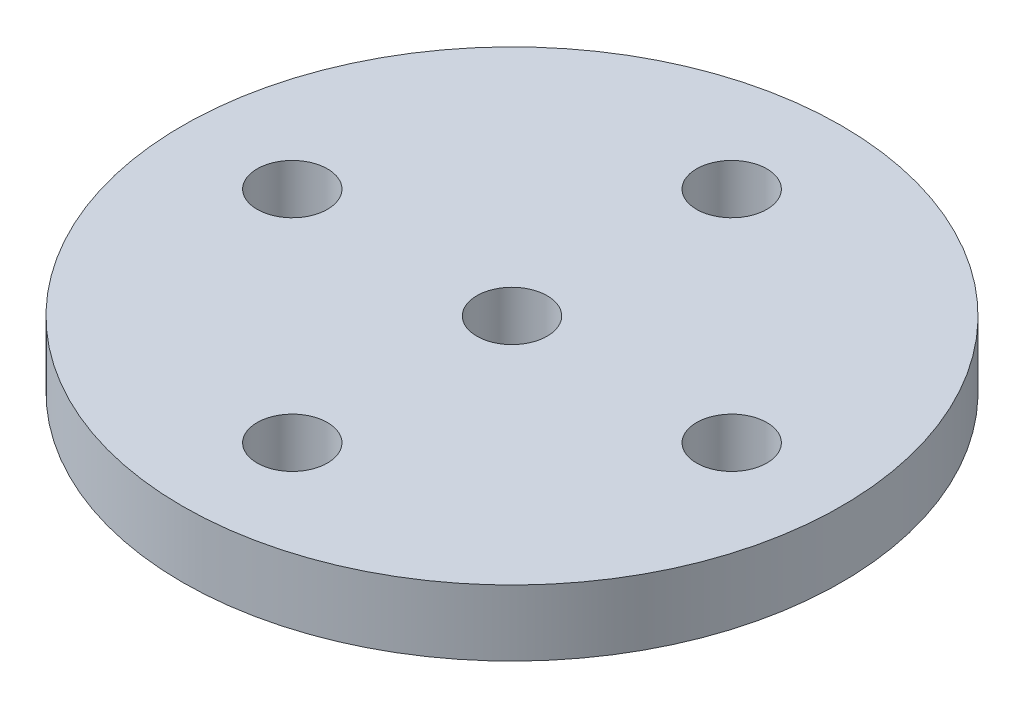
ISO-10303-21;
HEADER;
FILE_DESCRIPTION(('STEP AP214'),'2;1');
FILE_NAME('part.step','',(''),(''),'','','');
FILE_SCHEMA(('AUTOMOTIVE_DESIGN { 1 0 10303 214 1 1 1 1 }'));
ENDSEC;
DATA;
#1=APPLICATION_CONTEXT('core data for automotive mechanical design processes');
#2=APPLICATION_PROTOCOL_DEFINITION('international standard','automotive_design',2000,#1);
#3=PRODUCT_CONTEXT('',#1,'mechanical');
#4=PRODUCT('Part','Part','',(#3));
#5=PRODUCT_RELATED_PRODUCT_CATEGORY('part','',(#4));
#6=PRODUCT_DEFINITION_FORMATION('','',#4);
#7=PRODUCT_DEFINITION_CONTEXT('part definition',#1,'design');
#8=PRODUCT_DEFINITION('design','',#6,#7);
#9=PRODUCT_DEFINITION_SHAPE('','',#8);
#10=(LENGTH_UNIT() NAMED_UNIT(*) SI_UNIT(.MILLI.,.METRE.));
#11=(NAMED_UNIT(*) PLANE_ANGLE_UNIT() SI_UNIT($,.RADIAN.));
#12=(NAMED_UNIT(*) SI_UNIT($,.STERADIAN.) SOLID_ANGLE_UNIT());
#13=UNCERTAINTY_MEASURE_WITH_UNIT(LENGTH_MEASURE(1.E-05),#10,'distance_accuracy_value','');
#14=(GEOMETRIC_REPRESENTATION_CONTEXT(3) GLOBAL_UNCERTAINTY_ASSIGNED_CONTEXT((#13)) GLOBAL_UNIT_ASSIGNED_CONTEXT((#10,
#11,#12)) REPRESENTATION_CONTEXT('',''));
#15=CARTESIAN_POINT('',(0.,0.,0.));
#16=DIRECTION('',(0.,0.,1.));
#17=DIRECTION('',(1.,0.,0.));
#18=AXIS2_PLACEMENT_3D('',#15,#16,#17);
#19=CARTESIAN_POINT('',(0.,3.,0.));
#20=DIRECTION('',(0.,1.,0.));
#21=DIRECTION('',(0.,0.,1.));
#22=AXIS2_PLACEMENT_3D('',#19,#20,#21);
#23=PLANE('',#22);
#24=CARTESIAN_POINT('',(5.6598501634576E-13,3.,10.));
#25=DIRECTION('',(0.,1.,0.));
#26=DIRECTION('',(0.,0.,1.));
#27=AXIS2_PLACEMENT_3D('',#24,#25,#26);
#28=CIRCLE('',#27,1.60000000000061);
#29=CARTESIAN_POINT('',(5.6598501634576E-13,3.,11.6000000000006));
#30=VERTEX_POINT('',#29);
#31=EDGE_CURVE('E61',#30,#30,#28,.T.);
#32=ORIENTED_EDGE('',*,*,#31,.F.);
#33=EDGE_LOOP('',(#32));
#34=FACE_BOUND('',#33,.T.);
#35=CARTESIAN_POINT('',(0.,3.,-10.));
#36=DIRECTION('',(0.,1.,0.));
#37=DIRECTION('',(0.,0.,1.));
#38=AXIS2_PLACEMENT_3D('',#35,#36,#37);
#39=CIRCLE('',#38,1.6);
#40=CARTESIAN_POINT('',(0.,3.,-8.4));
#41=VERTEX_POINT('',#40);
#42=EDGE_CURVE('E49',#41,#41,#39,.T.);
#43=ORIENTED_EDGE('',*,*,#42,.F.);
#44=EDGE_LOOP('',(#43));
#45=FACE_BOUND('',#44,.T.);
#46=CARTESIAN_POINT('',(0.,3.,0.));
#47=DIRECTION('',(0.,1.,0.));
#48=DIRECTION('',(0.,0.,1.));
#49=AXIS2_PLACEMENT_3D('',#46,#47,#48);
#50=CIRCLE('',#49,15.);
#51=CARTESIAN_POINT('',(0.,3.,15.));
#52=VERTEX_POINT('',#51);
#53=EDGE_CURVE('E10',#52,#52,#50,.T.);
#54=ORIENTED_EDGE('',*,*,#53,.T.);
#55=EDGE_LOOP('',(#54));
#56=FACE_BOUND('',#55,.T.);
#57=CARTESIAN_POINT('',(0.,3.,0.));
#58=DIRECTION('',(0.,1.,0.));
#59=DIRECTION('',(0.,0.,1.));
#60=AXIS2_PLACEMENT_3D('',#57,#58,#59);
#61=CIRCLE('',#60,1.6);
#62=CARTESIAN_POINT('',(0.,3.,1.6));
#63=VERTEX_POINT('',#62);
#64=EDGE_CURVE('E44',#63,#63,#61,.T.);
#65=ORIENTED_EDGE('',*,*,#64,.F.);
#66=EDGE_LOOP('',(#65));
#67=FACE_BOUND('',#66,.T.);
#68=CARTESIAN_POINT('',(10.0000000000003,3.,-2.8299250817288E-13));
#69=DIRECTION('',(0.,1.,0.));
#70=DIRECTION('',(0.,0.,1.));
#71=AXIS2_PLACEMENT_3D('',#68,#69,#70);
#72=CIRCLE('',#71,1.60000000000022);
#73=CARTESIAN_POINT('',(10.0000000000003,3.,1.59999999999994));
#74=VERTEX_POINT('',#73);
#75=EDGE_CURVE('E55',#74,#74,#72,.T.);
#76=ORIENTED_EDGE('',*,*,#75,.F.);
#77=EDGE_LOOP('',(#76));
#78=FACE_BOUND('',#77,.T.);
#79=CARTESIAN_POINT('',(-9.99999999999972,3.,2.84217154972027E-13));
#80=DIRECTION('',(0.,1.,0.));
#81=DIRECTION('',(0.,0.,1.));
#82=AXIS2_PLACEMENT_3D('',#79,#80,#81);
#83=CIRCLE('',#82,1.60000000000046);
#84=CARTESIAN_POINT('',(-9.99999999999972,3.,1.60000000000074));
#85=VERTEX_POINT('',#84);
#86=EDGE_CURVE('E67',#85,#85,#83,.T.);
#87=ORIENTED_EDGE('',*,*,#86,.F.);
#88=EDGE_LOOP('',(#87));
#89=FACE_BOUND('',#88,.T.);
#90=ADVANCED_FACE('F33',(#34,#45,#56,#67,#78,#89),#23,.T.);
#91=CARTESIAN_POINT('',(0.,0.,0.));
#92=DIRECTION('',(0.,1.,0.));
#93=DIRECTION('',(0.,0.,1.));
#94=AXIS2_PLACEMENT_3D('',#91,#92,#93);
#95=PLANE('',#94);
#96=CARTESIAN_POINT('',(5.6598501634576E-13,0.,10.));
#97=DIRECTION('',(0.,1.,0.));
#98=DIRECTION('',(0.,0.,1.));
#99=AXIS2_PLACEMENT_3D('',#96,#97,#98);
#100=CIRCLE('',#99,1.60000000000061);
#101=CARTESIAN_POINT('',(5.6598501634576E-13,0.,11.6000000000006));
#102=VERTEX_POINT('',#101);
#103=EDGE_CURVE('E64',#102,#102,#100,.T.);
#104=ORIENTED_EDGE('',*,*,#103,.T.);
#105=EDGE_LOOP('',(#104));
#106=FACE_BOUND('',#105,.T.);
#107=CARTESIAN_POINT('',(0.,0.,-10.));
#108=DIRECTION('',(0.,1.,0.));
#109=DIRECTION('',(0.,0.,1.));
#110=AXIS2_PLACEMENT_3D('',#107,#108,#109);
#111=CIRCLE('',#110,1.6);
#112=CARTESIAN_POINT('',(0.,0.,-8.4));
#113=VERTEX_POINT('',#112);
#114=EDGE_CURVE('E52',#113,#113,#111,.T.);
#115=ORIENTED_EDGE('',*,*,#114,.T.);
#116=EDGE_LOOP('',(#115));
#117=FACE_BOUND('',#116,.T.);
#118=CARTESIAN_POINT('',(0.,0.,0.));
#119=DIRECTION('',(0.,1.,0.));
#120=DIRECTION('',(0.,0.,1.));
#121=AXIS2_PLACEMENT_3D('',#118,#119,#120);
#122=CIRCLE('',#121,15.);
#123=CARTESIAN_POINT('',(0.,0.,15.));
#124=VERTEX_POINT('',#123);
#125=EDGE_CURVE('E37',#124,#124,#122,.T.);
#126=ORIENTED_EDGE('',*,*,#125,.F.);
#127=EDGE_LOOP('',(#126));
#128=FACE_BOUND('',#127,.T.);
#129=CARTESIAN_POINT('',(0.,0.,0.));
#130=DIRECTION('',(0.,1.,0.));
#131=DIRECTION('',(0.,0.,1.));
#132=AXIS2_PLACEMENT_3D('',#129,#130,#131);
#133=CIRCLE('',#132,1.6);
#134=CARTESIAN_POINT('',(0.,0.,1.6));
#135=VERTEX_POINT('',#134);
#136=EDGE_CURVE('E46',#135,#135,#133,.T.);
#137=ORIENTED_EDGE('',*,*,#136,.T.);
#138=EDGE_LOOP('',(#137));
#139=FACE_BOUND('',#138,.T.);
#140=CARTESIAN_POINT('',(10.0000000000003,0.,-2.8299250817288E-13));
#141=DIRECTION('',(0.,1.,0.));
#142=DIRECTION('',(0.,0.,1.));
#143=AXIS2_PLACEMENT_3D('',#140,#141,#142);
#144=CIRCLE('',#143,1.60000000000022);
#145=CARTESIAN_POINT('',(10.0000000000003,0.,1.59999999999994));
#146=VERTEX_POINT('',#145);
#147=EDGE_CURVE('E58',#146,#146,#144,.T.);
#148=ORIENTED_EDGE('',*,*,#147,.T.);
#149=EDGE_LOOP('',(#148));
#150=FACE_BOUND('',#149,.T.);
#151=CARTESIAN_POINT('',(-9.99999999999972,0.,2.84217154972027E-13));
#152=DIRECTION('',(0.,1.,0.));
#153=DIRECTION('',(0.,0.,1.));
#154=AXIS2_PLACEMENT_3D('',#151,#152,#153);
#155=CIRCLE('',#154,1.60000000000046);
#156=CARTESIAN_POINT('',(-9.99999999999972,0.,1.60000000000074));
#157=VERTEX_POINT('',#156);
#158=EDGE_CURVE('E70',#157,#157,#155,.T.);
#159=ORIENTED_EDGE('',*,*,#158,.T.);
#160=EDGE_LOOP('',(#159));
#161=FACE_BOUND('',#160,.T.);
#162=ADVANCED_FACE('F80',(#106,#117,#128,#139,#150,#161),#95,.F.);
#163=CARTESIAN_POINT('',(0.,3.,0.));
#164=DIRECTION('',(0.,-1.,0.));
#165=DIRECTION('',(0.,0.,-1.));
#166=AXIS2_PLACEMENT_3D('',#163,#164,#165);
#167=CYLINDRICAL_SURFACE('',#166,15.);
#168=ORIENTED_EDGE('',*,*,#53,.F.);
#169=EDGE_LOOP('',(#168));
#170=FACE_BOUND('',#169,.T.);
#171=ORIENTED_EDGE('',*,*,#125,.T.);
#172=EDGE_LOOP('',(#171));
#173=FACE_BOUND('',#172,.T.);
#174=ADVANCED_FACE('F35',(#170,#173),#167,.T.);
#175=CARTESIAN_POINT('',(0.,3.,0.));
#176=DIRECTION('',(0.,-1.,0.));
#177=DIRECTION('',(0.,0.,-1.));
#178=AXIS2_PLACEMENT_3D('',#175,#176,#177);
#179=CYLINDRICAL_SURFACE('',#178,1.6);
#180=ORIENTED_EDGE('',*,*,#64,.T.);
#181=EDGE_LOOP('',(#180));
#182=FACE_BOUND('',#181,.T.);
#183=ORIENTED_EDGE('',*,*,#136,.F.);
#184=EDGE_LOOP('',(#183));
#185=FACE_BOUND('',#184,.T.);
#186=ADVANCED_FACE('F90',(#182,#185),#179,.F.);
#187=CARTESIAN_POINT('',(0.,3.,-10.));
#188=DIRECTION('',(0.,-1.,0.));
#189=DIRECTION('',(0.,0.,-1.));
#190=AXIS2_PLACEMENT_3D('',#187,#188,#189);
#191=CYLINDRICAL_SURFACE('',#190,1.6);
#192=ORIENTED_EDGE('',*,*,#42,.T.);
#193=EDGE_LOOP('',(#192));
#194=FACE_BOUND('',#193,.T.);
#195=ORIENTED_EDGE('',*,*,#114,.F.);
#196=EDGE_LOOP('',(#195));
#197=FACE_BOUND('',#196,.T.);
#198=ADVANCED_FACE('F93',(#194,#197),#191,.F.);
#199=CARTESIAN_POINT('',(10.0000000000003,3.,-2.8299250817288E-13));
#200=DIRECTION('',(0.,-1.,0.));
#201=DIRECTION('',(0.,0.,-1.));
#202=AXIS2_PLACEMENT_3D('',#199,#200,#201);
#203=CYLINDRICAL_SURFACE('',#202,1.60000000000022);
#204=ORIENTED_EDGE('',*,*,#75,.T.);
#205=EDGE_LOOP('',(#204));
#206=FACE_BOUND('',#205,.T.);
#207=ORIENTED_EDGE('',*,*,#147,.F.);
#208=EDGE_LOOP('',(#207));
#209=FACE_BOUND('',#208,.T.);
#210=ADVANCED_FACE('F97',(#206,#209),#203,.F.);
#211=CARTESIAN_POINT('',(5.6598501634576E-13,3.,10.));
#212=DIRECTION('',(0.,-1.,0.));
#213=DIRECTION('',(0.,0.,-1.));
#214=AXIS2_PLACEMENT_3D('',#211,#212,#213);
#215=CYLINDRICAL_SURFACE('',#214,1.60000000000061);
#216=ORIENTED_EDGE('',*,*,#31,.T.);
#217=EDGE_LOOP('',(#216));
#218=FACE_BOUND('',#217,.T.);
#219=ORIENTED_EDGE('',*,*,#103,.F.);
#220=EDGE_LOOP('',(#219));
#221=FACE_BOUND('',#220,.T.);
#222=ADVANCED_FACE('F101',(#218,#221),#215,.F.);
#223=CARTESIAN_POINT('',(-9.99999999999972,3.,2.84217154972027E-13));
#224=DIRECTION('',(0.,-1.,0.));
#225=DIRECTION('',(0.,0.,-1.));
#226=AXIS2_PLACEMENT_3D('',#223,#224,#225);
#227=CYLINDRICAL_SURFACE('',#226,1.60000000000046);
#228=ORIENTED_EDGE('',*,*,#86,.T.);
#229=EDGE_LOOP('',(#228));
#230=FACE_BOUND('',#229,.T.);
#231=ORIENTED_EDGE('',*,*,#158,.F.);
#232=EDGE_LOOP('',(#231));
#233=FACE_BOUND('',#232,.T.);
#234=ADVANCED_FACE('F76',(#230,#233),#227,.F.);
#235=CLOSED_SHELL('',(#90,#162,#174,#186,#198,#210,#222,#234));
#236=MANIFOLD_SOLID_BREP('B2',#235);
#237=ADVANCED_BREP_SHAPE_REPRESENTATION('',(#18,#236),#14);
#238=SHAPE_DEFINITION_REPRESENTATION(#9,#237);
ENDSEC;
END-ISO-10303-21;
